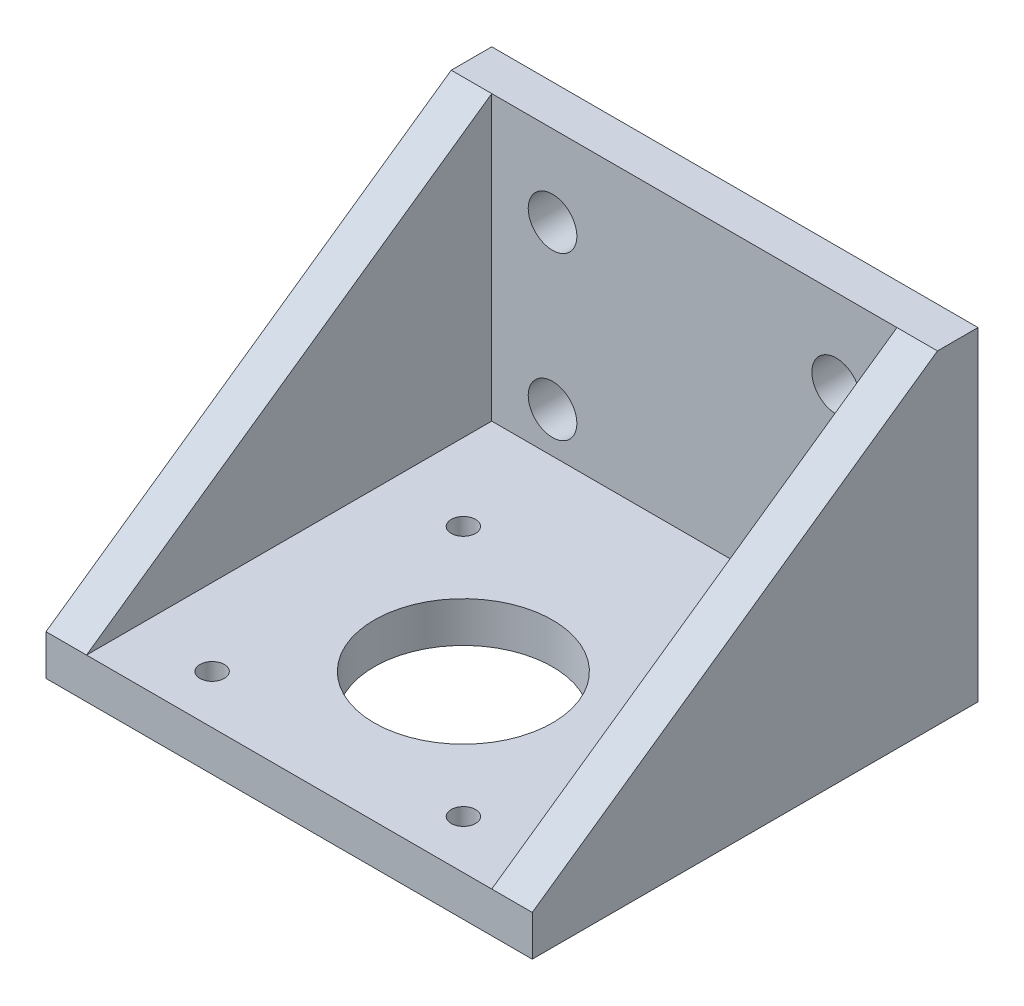
ISO-10303-21;
HEADER;
FILE_DESCRIPTION(('STEP AP214'),'2;1');
FILE_NAME('part.step','',(''),(''),'','','');
FILE_SCHEMA(('AUTOMOTIVE_DESIGN { 1 0 10303 214 1 1 1 1 }'));
ENDSEC;
DATA;
#1=APPLICATION_CONTEXT('core data for automotive mechanical design processes');
#2=APPLICATION_PROTOCOL_DEFINITION('international standard','automotive_design',2000,#1);
#3=PRODUCT_CONTEXT('',#1,'mechanical');
#4=PRODUCT('Part','Part','',(#3));
#5=PRODUCT_RELATED_PRODUCT_CATEGORY('part','',(#4));
#6=PRODUCT_DEFINITION_FORMATION('','',#4);
#7=PRODUCT_DEFINITION_CONTEXT('part definition',#1,'design');
#8=PRODUCT_DEFINITION('design','',#6,#7);
#9=PRODUCT_DEFINITION_SHAPE('','',#8);
#10=(LENGTH_UNIT() NAMED_UNIT(*) SI_UNIT(.MILLI.,.METRE.));
#11=(NAMED_UNIT(*) PLANE_ANGLE_UNIT() SI_UNIT($,.RADIAN.));
#12=(NAMED_UNIT(*) SI_UNIT($,.STERADIAN.) SOLID_ANGLE_UNIT());
#13=UNCERTAINTY_MEASURE_WITH_UNIT(LENGTH_MEASURE(1.E-05),#10,'distance_accuracy_value','');
#14=(GEOMETRIC_REPRESENTATION_CONTEXT(3) GLOBAL_UNCERTAINTY_ASSIGNED_CONTEXT((#13)) GLOBAL_UNIT_ASSIGNED_CONTEXT((#10,
#11,#12)) REPRESENTATION_CONTEXT('',''));
#15=CARTESIAN_POINT('',(0.,0.,0.));
#16=DIRECTION('',(0.,0.,1.));
#17=DIRECTION('',(1.,0.,0.));
#18=AXIS2_PLACEMENT_3D('',#15,#16,#17);
#19=CARTESIAN_POINT('',(0.,5.,0.));
#20=DIRECTION('',(0.,-1.,0.));
#21=DIRECTION('',(0.,0.,-1.));
#22=AXIS2_PLACEMENT_3D('',#19,#20,#21);
#23=PLANE('',#22);
#24=CARTESIAN_POINT('',(14.5,5.,-5.99999999999999));
#25=DIRECTION('',(0.,1.,0.));
#26=DIRECTION('',(0.,0.,1.));
#27=AXIS2_PLACEMENT_3D('',#24,#25,#26);
#28=CIRCLE('',#27,1.5);
#29=CARTESIAN_POINT('',(14.5,5.,-4.49999999999999));
#30=VERTEX_POINT('',#29);
#31=EDGE_CURVE('E141',#30,#30,#28,.T.);
#32=ORIENTED_EDGE('',*,*,#31,.F.);
#33=EDGE_LOOP('',(#32));
#34=FACE_BOUND('',#33,.T.);
#35=CARTESIAN_POINT('',(45.5,5.,-6.));
#36=DIRECTION('',(0.,1.,0.));
#37=DIRECTION('',(0.,0.,1.));
#38=AXIS2_PLACEMENT_3D('',#35,#36,#37);
#39=CIRCLE('',#38,1.5);
#40=CARTESIAN_POINT('',(45.5,5.,-4.49999999999999));
#41=VERTEX_POINT('',#40);
#42=EDGE_CURVE('E147',#41,#41,#39,.T.);
#43=ORIENTED_EDGE('',*,*,#42,.F.);
#44=EDGE_LOOP('',(#43));
#45=FACE_BOUND('',#44,.T.);
#46=CARTESIAN_POINT('',(45.5,5.,-37.));
#47=DIRECTION('',(0.,1.,0.));
#48=DIRECTION('',(0.,0.,1.));
#49=AXIS2_PLACEMENT_3D('',#46,#47,#48);
#50=CIRCLE('',#49,1.5);
#51=CARTESIAN_POINT('',(45.5,5.,-35.5));
#52=VERTEX_POINT('',#51);
#53=EDGE_CURVE('E153',#52,#52,#50,.T.);
#54=ORIENTED_EDGE('',*,*,#53,.F.);
#55=EDGE_LOOP('',(#54));
#56=FACE_BOUND('',#55,.T.);
#57=CARTESIAN_POINT('',(14.5,5.,-37.));
#58=DIRECTION('',(0.,1.,0.));
#59=DIRECTION('',(0.,0.,1.));
#60=AXIS2_PLACEMENT_3D('',#57,#58,#59);
#61=CIRCLE('',#60,1.5);
#62=CARTESIAN_POINT('',(14.5,5.,-35.5));
#63=VERTEX_POINT('',#62);
#64=EDGE_CURVE('E159',#63,#63,#61,.T.);
#65=ORIENTED_EDGE('',*,*,#64,.F.);
#66=EDGE_LOOP('',(#65));
#67=FACE_BOUND('',#66,.T.);
#68=CARTESIAN_POINT('',(30.,5.,-21.5));
#69=DIRECTION('',(0.,1.,0.));
#70=DIRECTION('',(0.,0.,1.));
#71=AXIS2_PLACEMENT_3D('',#68,#69,#70);
#72=CIRCLE('',#71,11.);
#73=CARTESIAN_POINT('',(30.,5.,-10.5));
#74=VERTEX_POINT('',#73);
#75=EDGE_CURVE('E165',#74,#74,#72,.T.);
#76=ORIENTED_EDGE('',*,*,#75,.F.);
#77=EDGE_LOOP('',(#76));
#78=FACE_BOUND('',#77,.T.);
#79=DIRECTION('',(0.,0.,-1.));
#80=VECTOR('',#79,1.);
#81=CARTESIAN_POINT('',(5.00000000000001,5.,0.));
#82=LINE('',#81,#80);
#83=CARTESIAN_POINT('',(5.,5.,0.));
#84=VERTEX_POINT('',#83);
#85=CARTESIAN_POINT('',(5.00000000000001,5.,-50.));
#86=VERTEX_POINT('',#85);
#87=EDGE_CURVE('E130',#84,#86,#82,.T.);
#88=ORIENTED_EDGE('',*,*,#87,.F.);
#89=DIRECTION('',(1.,0.,0.));
#90=VECTOR('',#89,1.);
#91=CARTESIAN_POINT('',(0.,5.,0.));
#92=LINE('',#91,#90);
#93=CARTESIAN_POINT('',(55.,5.,0.));
#94=VERTEX_POINT('',#93);
#95=EDGE_CURVE('E171',#84,#94,#92,.T.);
#96=ORIENTED_EDGE('',*,*,#95,.T.);
#97=DIRECTION('',(0.,0.,1.));
#98=VECTOR('',#97,1.);
#99=CARTESIAN_POINT('',(55.,5.,-50.));
#100=LINE('',#99,#98);
#101=CARTESIAN_POINT('',(55.,5.,-50.));
#102=VERTEX_POINT('',#101);
#103=EDGE_CURVE('E135',#102,#94,#100,.T.);
#104=ORIENTED_EDGE('',*,*,#103,.F.);
#105=DIRECTION('',(1.,0.,0.));
#106=VECTOR('',#105,1.);
#107=CARTESIAN_POINT('',(5.00000000000001,5.,-50.));
#108=LINE('',#107,#106);
#109=EDGE_CURVE('E58',#86,#102,#108,.T.);
#110=ORIENTED_EDGE('',*,*,#109,.F.);
#111=EDGE_LOOP('',(#88,#96,#104,#110));
#112=FACE_BOUND('',#111,.T.);
#113=ADVANCED_FACE('F35',(#34,#45,#56,#67,#78,#112),#23,.F.);
#114=CARTESIAN_POINT('',(0.,0.,0.));
#115=DIRECTION('',(0.,-1.,0.));
#116=DIRECTION('',(0.,0.,-1.));
#117=AXIS2_PLACEMENT_3D('',#114,#115,#116);
#118=PLANE('',#117);
#119=CARTESIAN_POINT('',(45.5,0.,-6.));
#120=DIRECTION('',(0.,1.,0.));
#121=DIRECTION('',(0.,0.,1.));
#122=AXIS2_PLACEMENT_3D('',#119,#120,#121);
#123=CIRCLE('',#122,1.5);
#124=CARTESIAN_POINT('',(45.5,0.,-4.49999999999999));
#125=VERTEX_POINT('',#124);
#126=EDGE_CURVE('E144',#125,#125,#123,.T.);
#127=ORIENTED_EDGE('',*,*,#126,.T.);
#128=EDGE_LOOP('',(#127));
#129=FACE_BOUND('',#128,.T.);
#130=CARTESIAN_POINT('',(14.5,0.,-37.));
#131=DIRECTION('',(0.,1.,0.));
#132=DIRECTION('',(0.,0.,1.));
#133=AXIS2_PLACEMENT_3D('',#130,#131,#132);
#134=CIRCLE('',#133,1.5);
#135=CARTESIAN_POINT('',(14.5,0.,-35.5));
#136=VERTEX_POINT('',#135);
#137=EDGE_CURVE('E156',#136,#136,#134,.T.);
#138=ORIENTED_EDGE('',*,*,#137,.T.);
#139=EDGE_LOOP('',(#138));
#140=FACE_BOUND('',#139,.T.);
#141=DIRECTION('',(0.,0.,1.));
#142=VECTOR('',#141,1.);
#143=CARTESIAN_POINT('',(0.,0.,0.));
#144=LINE('',#143,#142);
#145=CARTESIAN_POINT('',(0.,0.,-55.));
#146=VERTEX_POINT('',#145);
#147=CARTESIAN_POINT('',(0.,0.,0.));
#148=VERTEX_POINT('',#147);
#149=EDGE_CURVE('E168',#146,#148,#144,.T.);
#150=ORIENTED_EDGE('',*,*,#149,.F.);
#151=DIRECTION('',(-1.,0.,0.));
#152=VECTOR('',#151,1.);
#153=CARTESIAN_POINT('',(0.,0.,-55.));
#154=LINE('',#153,#152);
#155=CARTESIAN_POINT('',(60.,0.,-55.));
#156=VERTEX_POINT('',#155);
#157=EDGE_CURVE('E175',#156,#146,#154,.T.);
#158=ORIENTED_EDGE('',*,*,#157,.F.);
#159=DIRECTION('',(0.,0.,-1.));
#160=VECTOR('',#159,1.);
#161=CARTESIAN_POINT('',(60.,0.,0.));
#162=LINE('',#161,#160);
#163=CARTESIAN_POINT('',(60.,0.,0.));
#164=VERTEX_POINT('',#163);
#165=EDGE_CURVE('E180',#164,#156,#162,.T.);
#166=ORIENTED_EDGE('',*,*,#165,.F.);
#167=DIRECTION('',(1.,0.,0.));
#168=VECTOR('',#167,1.);
#169=CARTESIAN_POINT('',(0.,0.,0.));
#170=LINE('',#169,#168);
#171=EDGE_CURVE('E177',#148,#164,#170,.T.);
#172=ORIENTED_EDGE('',*,*,#171,.F.);
#173=EDGE_LOOP('',(#150,#158,#166,#172));
#174=FACE_BOUND('',#173,.T.);
#175=CARTESIAN_POINT('',(30.,0.,-21.5));
#176=DIRECTION('',(0.,1.,0.));
#177=DIRECTION('',(0.,0.,1.));
#178=AXIS2_PLACEMENT_3D('',#175,#176,#177);
#179=CIRCLE('',#178,11.);
#180=CARTESIAN_POINT('',(30.,0.,-10.5));
#181=VERTEX_POINT('',#180);
#182=EDGE_CURVE('E162',#181,#181,#179,.T.);
#183=ORIENTED_EDGE('',*,*,#182,.T.);
#184=EDGE_LOOP('',(#183));
#185=FACE_BOUND('',#184,.T.);
#186=CARTESIAN_POINT('',(45.5,0.,-37.));
#187=DIRECTION('',(0.,1.,0.));
#188=DIRECTION('',(0.,0.,1.));
#189=AXIS2_PLACEMENT_3D('',#186,#187,#188);
#190=CIRCLE('',#189,1.5);
#191=CARTESIAN_POINT('',(45.5,0.,-35.5));
#192=VERTEX_POINT('',#191);
#193=EDGE_CURVE('E150',#192,#192,#190,.T.);
#194=ORIENTED_EDGE('',*,*,#193,.T.);
#195=EDGE_LOOP('',(#194));
#196=FACE_BOUND('',#195,.T.);
#197=CARTESIAN_POINT('',(14.5,0.,-5.99999999999999));
#198=DIRECTION('',(0.,1.,0.));
#199=DIRECTION('',(0.,0.,1.));
#200=AXIS2_PLACEMENT_3D('',#197,#198,#199);
#201=CIRCLE('',#200,1.5);
#202=CARTESIAN_POINT('',(14.5,0.,-4.49999999999999));
#203=VERTEX_POINT('',#202);
#204=EDGE_CURVE('E140',#203,#203,#201,.T.);
#205=ORIENTED_EDGE('',*,*,#204,.T.);
#206=EDGE_LOOP('',(#205));
#207=FACE_BOUND('',#206,.T.);
#208=ADVANCED_FACE('F197',(#129,#140,#174,#185,#196,#207),#118,.T.);
#209=CARTESIAN_POINT('',(0.,5.,0.));
#210=DIRECTION('',(1.,0.,0.));
#211=DIRECTION('',(0.,0.,-1.));
#212=AXIS2_PLACEMENT_3D('',#209,#210,#211);
#213=PLANE('',#212);
#214=DIRECTION('',(0.,-1.,0.));
#215=VECTOR('',#214,1.);
#216=CARTESIAN_POINT('',(0.,5.,0.));
#217=LINE('',#216,#215);
#218=CARTESIAN_POINT('',(0.,5.,0.));
#219=VERTEX_POINT('',#218);
#220=EDGE_CURVE('E43',#219,#148,#217,.T.);
#221=ORIENTED_EDGE('',*,*,#220,.F.);
#222=DIRECTION('',(0.,-0.573462344363328,0.81923192051904));
#223=VECTOR('',#222,1.);
#224=CARTESIAN_POINT('',(0.,5.,0.));
#225=LINE('',#224,#223);
#226=CARTESIAN_POINT('',(0.,40.,-50.));
#227=VERTEX_POINT('',#226);
#228=EDGE_CURVE('E101',#227,#219,#225,.T.);
#229=ORIENTED_EDGE('',*,*,#228,.F.);
#230=DIRECTION('',(0.,0.,1.));
#231=VECTOR('',#230,1.);
#232=CARTESIAN_POINT('',(0.,40.,-55.));
#233=LINE('',#232,#231);
#234=CARTESIAN_POINT('',(0.,40.,-55.));
#235=VERTEX_POINT('',#234);
#236=EDGE_CURVE('E113',#235,#227,#233,.T.);
#237=ORIENTED_EDGE('',*,*,#236,.F.);
#238=DIRECTION('',(0.,-1.,0.));
#239=VECTOR('',#238,1.);
#240=CARTESIAN_POINT('',(0.,5.,-55.));
#241=LINE('',#240,#239);
#242=EDGE_CURVE('E174',#235,#146,#241,.T.);
#243=ORIENTED_EDGE('',*,*,#242,.T.);
#244=ORIENTED_EDGE('',*,*,#149,.T.);
#245=EDGE_LOOP('',(#221,#229,#237,#243,#244));
#246=FACE_BOUND('',#245,.T.);
#247=ADVANCED_FACE('F37',(#246),#213,.F.);
#248=CARTESIAN_POINT('',(0.,5.,0.));
#249=DIRECTION('',(0.,0.,-1.));
#250=DIRECTION('',(-1.,0.,0.));
#251=AXIS2_PLACEMENT_3D('',#248,#249,#250);
#252=PLANE('',#251);
#253=DIRECTION('',(0.,-1.,0.));
#254=VECTOR('',#253,1.);
#255=CARTESIAN_POINT('',(60.,5.,0.));
#256=LINE('',#255,#254);
#257=CARTESIAN_POINT('',(60.,5.,0.));
#258=VERTEX_POINT('',#257);
#259=EDGE_CURVE('E187',#258,#164,#256,.T.);
#260=ORIENTED_EDGE('',*,*,#259,.F.);
#261=DIRECTION('',(-1.,0.,0.));
#262=VECTOR('',#261,1.);
#263=CARTESIAN_POINT('',(121.032778078669,5.,0.));
#264=LINE('',#263,#262);
#265=EDGE_CURVE('E207',#258,#94,#264,.T.);
#266=ORIENTED_EDGE('',*,*,#265,.T.);
#267=ORIENTED_EDGE('',*,*,#95,.F.);
#268=EDGE_CURVE('E194',#84,#219,#264,.T.);
#269=ORIENTED_EDGE('',*,*,#268,.T.);
#270=ORIENTED_EDGE('',*,*,#220,.T.);
#271=ORIENTED_EDGE('',*,*,#171,.T.);
#272=EDGE_LOOP('',(#260,#266,#267,#269,#270,#271));
#273=FACE_BOUND('',#272,.T.);
#274=ADVANCED_FACE('F191',(#273),#252,.F.);
#275=CARTESIAN_POINT('',(60.,5.,0.));
#276=DIRECTION('',(-1.,0.,0.));
#277=DIRECTION('',(0.,0.,1.));
#278=AXIS2_PLACEMENT_3D('',#275,#276,#277);
#279=PLANE('',#278);
#280=DIRECTION('',(0.,0.,-1.));
#281=VECTOR('',#280,1.);
#282=CARTESIAN_POINT('',(60.,40.,0.));
#283=LINE('',#282,#281);
#284=CARTESIAN_POINT('',(60.,40.,-50.));
#285=VERTEX_POINT('',#284);
#286=CARTESIAN_POINT('',(60.,40.,-55.));
#287=VERTEX_POINT('',#286);
#288=EDGE_CURVE('E126',#285,#287,#283,.T.);
#289=ORIENTED_EDGE('',*,*,#288,.F.);
#290=DIRECTION('',(0.,0.573462344363328,-0.81923192051904));
#291=VECTOR('',#290,1.);
#292=CARTESIAN_POINT('',(60.,5.,0.));
#293=LINE('',#292,#291);
#294=EDGE_CURVE('E50',#258,#285,#293,.T.);
#295=ORIENTED_EDGE('',*,*,#294,.F.);
#296=ORIENTED_EDGE('',*,*,#259,.T.);
#297=ORIENTED_EDGE('',*,*,#165,.T.);
#298=DIRECTION('',(0.,-1.,0.));
#299=VECTOR('',#298,1.);
#300=CARTESIAN_POINT('',(60.,5.,-55.));
#301=LINE('',#300,#299);
#302=EDGE_CURVE('E184',#287,#156,#301,.T.);
#303=ORIENTED_EDGE('',*,*,#302,.F.);
#304=EDGE_LOOP('',(#289,#295,#296,#297,#303));
#305=FACE_BOUND('',#304,.T.);
#306=ADVANCED_FACE('F205',(#305),#279,.F.);
#307=CARTESIAN_POINT('',(0.,5.,-55.));
#308=DIRECTION('',(0.,0.,1.));
#309=DIRECTION('',(1.,0.,0.));
#310=AXIS2_PLACEMENT_3D('',#307,#308,#309);
#311=PLANE('',#310);
#312=CARTESIAN_POINT('',(12.5,30.,-55.));
#313=DIRECTION('',(0.,0.,-1.));
#314=DIRECTION('',(-1.,0.,0.));
#315=AXIS2_PLACEMENT_3D('',#312,#313,#314);
#316=CIRCLE('',#315,3.);
#317=CARTESIAN_POINT('',(9.49999999999999,30.,-55.));
#318=VERTEX_POINT('',#317);
#319=EDGE_CURVE('E227',#318,#318,#316,.T.);
#320=ORIENTED_EDGE('',*,*,#319,.F.);
#321=EDGE_LOOP('',(#320));
#322=FACE_BOUND('',#321,.T.);
#323=CARTESIAN_POINT('',(47.5,30.,-55.));
#324=DIRECTION('',(0.,0.,-1.));
#325=DIRECTION('',(-1.,0.,0.));
#326=AXIS2_PLACEMENT_3D('',#323,#324,#325);
#327=CIRCLE('',#326,3.);
#328=CARTESIAN_POINT('',(44.5,30.,-55.));
#329=VERTEX_POINT('',#328);
#330=EDGE_CURVE('E235',#329,#329,#327,.T.);
#331=ORIENTED_EDGE('',*,*,#330,.F.);
#332=EDGE_LOOP('',(#331));
#333=FACE_BOUND('',#332,.T.);
#334=CARTESIAN_POINT('',(47.5,10.,-55.));
#335=DIRECTION('',(0.,0.,-1.));
#336=DIRECTION('',(-1.,0.,0.));
#337=AXIS2_PLACEMENT_3D('',#334,#335,#336);
#338=CIRCLE('',#337,3.);
#339=CARTESIAN_POINT('',(44.5,10.,-55.));
#340=VERTEX_POINT('',#339);
#341=EDGE_CURVE('E219',#340,#340,#338,.T.);
#342=ORIENTED_EDGE('',*,*,#341,.F.);
#343=EDGE_LOOP('',(#342));
#344=FACE_BOUND('',#343,.T.);
#345=CARTESIAN_POINT('',(12.5,10.,-55.));
#346=DIRECTION('',(0.,0.,-1.));
#347=DIRECTION('',(-1.,0.,0.));
#348=AXIS2_PLACEMENT_3D('',#345,#346,#347);
#349=CIRCLE('',#348,3.);
#350=CARTESIAN_POINT('',(9.49999999999999,10.,-55.));
#351=VERTEX_POINT('',#350);
#352=EDGE_CURVE('E234',#351,#351,#349,.T.);
#353=ORIENTED_EDGE('',*,*,#352,.F.);
#354=EDGE_LOOP('',(#353));
#355=FACE_BOUND('',#354,.T.);
#356=ORIENTED_EDGE('',*,*,#157,.T.);
#357=ORIENTED_EDGE('',*,*,#242,.F.);
#358=DIRECTION('',(-1.,0.,0.));
#359=VECTOR('',#358,1.);
#360=CARTESIAN_POINT('',(60.,40.,-55.));
#361=LINE('',#360,#359);
#362=EDGE_CURVE('E120',#287,#235,#361,.T.);
#363=ORIENTED_EDGE('',*,*,#362,.F.);
#364=ORIENTED_EDGE('',*,*,#302,.T.);
#365=EDGE_LOOP('',(#356,#357,#363,#364));
#366=FACE_BOUND('',#365,.T.);
#367=ADVANCED_FACE('F201',(#322,#333,#344,#355,#366),#311,.F.);
#368=CARTESIAN_POINT('',(30.,5.,-21.5));
#369=DIRECTION('',(0.,-1.,0.));
#370=DIRECTION('',(0.,0.,-1.));
#371=AXIS2_PLACEMENT_3D('',#368,#369,#370);
#372=CYLINDRICAL_SURFACE('',#371,11.);
#373=ORIENTED_EDGE('',*,*,#75,.T.);
#374=EDGE_LOOP('',(#373));
#375=FACE_BOUND('',#374,.T.);
#376=ORIENTED_EDGE('',*,*,#182,.F.);
#377=EDGE_LOOP('',(#376));
#378=FACE_BOUND('',#377,.T.);
#379=ADVANCED_FACE('F269',(#375,#378),#372,.F.);
#380=CARTESIAN_POINT('',(14.5,5.,-37.));
#381=DIRECTION('',(0.,-1.,0.));
#382=DIRECTION('',(0.,0.,-1.));
#383=AXIS2_PLACEMENT_3D('',#380,#381,#382);
#384=CYLINDRICAL_SURFACE('',#383,1.5);
#385=ORIENTED_EDGE('',*,*,#64,.T.);
#386=EDGE_LOOP('',(#385));
#387=FACE_BOUND('',#386,.T.);
#388=ORIENTED_EDGE('',*,*,#137,.F.);
#389=EDGE_LOOP('',(#388));
#390=FACE_BOUND('',#389,.T.);
#391=ADVANCED_FACE('F296',(#387,#390),#384,.F.);
#392=CARTESIAN_POINT('',(45.5,5.,-37.));
#393=DIRECTION('',(0.,-1.,0.));
#394=DIRECTION('',(0.,0.,-1.));
#395=AXIS2_PLACEMENT_3D('',#392,#393,#394);
#396=CYLINDRICAL_SURFACE('',#395,1.5);
#397=ORIENTED_EDGE('',*,*,#53,.T.);
#398=EDGE_LOOP('',(#397));
#399=FACE_BOUND('',#398,.T.);
#400=ORIENTED_EDGE('',*,*,#193,.F.);
#401=EDGE_LOOP('',(#400));
#402=FACE_BOUND('',#401,.T.);
#403=ADVANCED_FACE('F306',(#399,#402),#396,.F.);
#404=CARTESIAN_POINT('',(45.5,5.,-6.));
#405=DIRECTION('',(0.,-1.,0.));
#406=DIRECTION('',(0.,0.,-1.));
#407=AXIS2_PLACEMENT_3D('',#404,#405,#406);
#408=CYLINDRICAL_SURFACE('',#407,1.5);
#409=ORIENTED_EDGE('',*,*,#42,.T.);
#410=EDGE_LOOP('',(#409));
#411=FACE_BOUND('',#410,.T.);
#412=ORIENTED_EDGE('',*,*,#126,.F.);
#413=EDGE_LOOP('',(#412));
#414=FACE_BOUND('',#413,.T.);
#415=ADVANCED_FACE('F315',(#411,#414),#408,.F.);
#416=CARTESIAN_POINT('',(14.5,5.,-5.99999999999999));
#417=DIRECTION('',(0.,-1.,0.));
#418=DIRECTION('',(0.,0.,-1.));
#419=AXIS2_PLACEMENT_3D('',#416,#417,#418);
#420=CYLINDRICAL_SURFACE('',#419,1.5);
#421=ORIENTED_EDGE('',*,*,#31,.T.);
#422=EDGE_LOOP('',(#421));
#423=FACE_BOUND('',#422,.T.);
#424=ORIENTED_EDGE('',*,*,#204,.F.);
#425=EDGE_LOOP('',(#424));
#426=FACE_BOUND('',#425,.T.);
#427=ADVANCED_FACE('F325',(#423,#426),#420,.F.);
#428=CARTESIAN_POINT('',(5.00000000000001,40.,0.));
#429=DIRECTION('',(-1.,0.,0.));
#430=DIRECTION('',(0.,0.,1.));
#431=AXIS2_PLACEMENT_3D('',#428,#429,#430);
#432=PLANE('',#431);
#433=DIRECTION('',(0.,-1.,0.));
#434=VECTOR('',#433,1.);
#435=CARTESIAN_POINT('',(5.00000000000001,40.,-50.));
#436=LINE('',#435,#434);
#437=CARTESIAN_POINT('',(5.00000000000001,40.,-50.));
#438=VERTEX_POINT('',#437);
#439=EDGE_CURVE('E124',#438,#86,#436,.T.);
#440=ORIENTED_EDGE('',*,*,#439,.F.);
#441=DIRECTION('',(0.,-0.573462344363328,0.81923192051904));
#442=VECTOR('',#441,1.);
#443=CARTESIAN_POINT('',(5.00000000000001,16.510067114094,-16.4429530201342));
#444=LINE('',#443,#442);
#445=EDGE_CURVE('E104',#438,#84,#444,.T.);
#446=ORIENTED_EDGE('',*,*,#445,.T.);
#447=ORIENTED_EDGE('',*,*,#87,.T.);
#448=EDGE_LOOP('',(#440,#446,#447));
#449=FACE_BOUND('',#448,.T.);
#450=ADVANCED_FACE('F218',(#449),#432,.F.);
#451=CARTESIAN_POINT('',(5.00000000000001,40.,-50.));
#452=DIRECTION('',(0.,0.,-1.));
#453=DIRECTION('',(-1.,0.,0.));
#454=AXIS2_PLACEMENT_3D('',#451,#452,#453);
#455=PLANE('',#454);
#456=CARTESIAN_POINT('',(12.5,30.,-50.));
#457=DIRECTION('',(0.,0.,-1.));
#458=DIRECTION('',(-1.,0.,0.));
#459=AXIS2_PLACEMENT_3D('',#456,#457,#458);
#460=CIRCLE('',#459,3.);
#461=CARTESIAN_POINT('',(9.49999999999999,30.,-50.));
#462=VERTEX_POINT('',#461);
#463=EDGE_CURVE('E230',#462,#462,#460,.F.);
#464=ORIENTED_EDGE('',*,*,#463,.F.);
#465=EDGE_LOOP('',(#464));
#466=FACE_BOUND('',#465,.T.);
#467=CARTESIAN_POINT('',(47.5,30.,-50.));
#468=DIRECTION('',(0.,0.,-1.));
#469=DIRECTION('',(-1.,0.,0.));
#470=AXIS2_PLACEMENT_3D('',#467,#468,#469);
#471=CIRCLE('',#470,3.);
#472=CARTESIAN_POINT('',(44.5,30.,-50.));
#473=VERTEX_POINT('',#472);
#474=EDGE_CURVE('E231',#473,#473,#471,.F.);
#475=ORIENTED_EDGE('',*,*,#474,.F.);
#476=EDGE_LOOP('',(#475));
#477=FACE_BOUND('',#476,.T.);
#478=CARTESIAN_POINT('',(47.5,10.,-50.));
#479=DIRECTION('',(0.,0.,-1.));
#480=DIRECTION('',(-1.,0.,0.));
#481=AXIS2_PLACEMENT_3D('',#478,#479,#480);
#482=CIRCLE('',#481,3.);
#483=CARTESIAN_POINT('',(44.5,10.,-50.));
#484=VERTEX_POINT('',#483);
#485=EDGE_CURVE('E222',#484,#484,#482,.F.);
#486=ORIENTED_EDGE('',*,*,#485,.F.);
#487=EDGE_LOOP('',(#486));
#488=FACE_BOUND('',#487,.T.);
#489=CARTESIAN_POINT('',(12.5,10.,-50.));
#490=DIRECTION('',(0.,0.,-1.));
#491=DIRECTION('',(-1.,0.,0.));
#492=AXIS2_PLACEMENT_3D('',#489,#490,#491);
#493=CIRCLE('',#492,3.);
#494=CARTESIAN_POINT('',(9.49999999999999,10.,-50.));
#495=VERTEX_POINT('',#494);
#496=EDGE_CURVE('E133',#495,#495,#493,.F.);
#497=ORIENTED_EDGE('',*,*,#496,.F.);
#498=EDGE_LOOP('',(#497));
#499=FACE_BOUND('',#498,.T.);
#500=ORIENTED_EDGE('',*,*,#109,.T.);
#501=DIRECTION('',(0.,-1.,0.));
#502=VECTOR('',#501,1.);
#503=CARTESIAN_POINT('',(55.,40.,-50.));
#504=LINE('',#503,#502);
#505=CARTESIAN_POINT('',(55.,40.,-50.));
#506=VERTEX_POINT('',#505);
#507=EDGE_CURVE('E121',#506,#102,#504,.T.);
#508=ORIENTED_EDGE('',*,*,#507,.F.);
#509=DIRECTION('',(1.,0.,0.));
#510=VECTOR('',#509,1.);
#511=CARTESIAN_POINT('',(5.00000000000001,40.,-50.));
#512=LINE('',#511,#510);
#513=EDGE_CURVE('E137',#438,#506,#512,.T.);
#514=ORIENTED_EDGE('',*,*,#513,.F.);
#515=ORIENTED_EDGE('',*,*,#439,.T.);
#516=EDGE_LOOP('',(#500,#508,#514,#515));
#517=FACE_BOUND('',#516,.T.);
#518=ADVANCED_FACE('F215',(#466,#477,#488,#499,#517),#455,.F.);
#519=CARTESIAN_POINT('',(55.,40.,-50.));
#520=DIRECTION('',(1.,0.,0.));
#521=DIRECTION('',(0.,0.,-1.));
#522=AXIS2_PLACEMENT_3D('',#519,#520,#521);
#523=PLANE('',#522);
#524=ORIENTED_EDGE('',*,*,#103,.T.);
#525=DIRECTION('',(0.,0.573462344363328,-0.81923192051904));
#526=VECTOR('',#525,1.);
#527=CARTESIAN_POINT('',(55.,40.,-50.));
#528=LINE('',#527,#526);
#529=EDGE_CURVE('E212',#94,#506,#528,.T.);
#530=ORIENTED_EDGE('',*,*,#529,.T.);
#531=ORIENTED_EDGE('',*,*,#507,.T.);
#532=EDGE_LOOP('',(#524,#530,#531));
#533=FACE_BOUND('',#532,.T.);
#534=ADVANCED_FACE('F211',(#533),#523,.F.);
#535=CARTESIAN_POINT('',(0.,40.,0.));
#536=DIRECTION('',(0.,-1.,0.));
#537=DIRECTION('',(0.,0.,-1.));
#538=AXIS2_PLACEMENT_3D('',#535,#536,#537);
#539=PLANE('',#538);
#540=ORIENTED_EDGE('',*,*,#236,.T.);
#541=DIRECTION('',(1.,0.,0.));
#542=VECTOR('',#541,1.);
#543=CARTESIAN_POINT('',(0.,40.,-50.));
#544=LINE('',#543,#542);
#545=EDGE_CURVE('E11',#227,#438,#544,.T.);
#546=ORIENTED_EDGE('',*,*,#545,.T.);
#547=ORIENTED_EDGE('',*,*,#513,.T.);
#548=DIRECTION('',(-1.,0.,0.));
#549=VECTOR('',#548,1.);
#550=CARTESIAN_POINT('',(121.032778078669,40.,-50.));
#551=LINE('',#550,#549);
#552=EDGE_CURVE('E115',#285,#506,#551,.T.);
#553=ORIENTED_EDGE('',*,*,#552,.F.);
#554=ORIENTED_EDGE('',*,*,#288,.T.);
#555=ORIENTED_EDGE('',*,*,#362,.T.);
#556=EDGE_LOOP('',(#540,#546,#547,#553,#554,#555));
#557=FACE_BOUND('',#556,.T.);
#558=ADVANCED_FACE('F118',(#557),#539,.F.);
#559=CARTESIAN_POINT('',(12.5,10.,-41.5147186257614));
#560=DIRECTION('',(0.,0.,-1.));
#561=DIRECTION('',(-1.,0.,0.));
#562=AXIS2_PLACEMENT_3D('',#559,#560,#561);
#563=CYLINDRICAL_SURFACE('',#562,3.);
#564=CARTESIAN_POINT('',(9.49999999999999,10.,-50.));
#565=CARTESIAN_POINT('',(9.49999999999999,10.,-50.0520833333333));
#566=CARTESIAN_POINT('',(9.49999999999999,10.,-50.1041666666667));
#567=CARTESIAN_POINT('',(9.49999999999999,10.,-50.2083333333333));
#568=CARTESIAN_POINT('',(9.49999999999999,10.,-50.2604166666667));
#569=CARTESIAN_POINT('',(9.49999999999999,10.,-50.3645833333333));
#570=CARTESIAN_POINT('',(9.49999999999999,10.,-50.4166666666667));
#571=CARTESIAN_POINT('',(9.49999999999999,10.,-50.5208333333333));
#572=CARTESIAN_POINT('',(9.49999999999999,10.,-50.5729166666667));
#573=CARTESIAN_POINT('',(9.49999999999999,10.,-50.6770833333333));
#574=CARTESIAN_POINT('',(9.49999999999999,10.,-50.7291666666667));
#575=CARTESIAN_POINT('',(9.49999999999999,10.,-50.8333333333333));
#576=CARTESIAN_POINT('',(9.49999999999999,10.,-50.8854166666667));
#577=CARTESIAN_POINT('',(9.49999999999999,10.,-50.9895833333333));
#578=CARTESIAN_POINT('',(9.49999999999999,10.,-51.0416666666667));
#579=CARTESIAN_POINT('',(9.49999999999999,10.,-51.1458333333333));
#580=CARTESIAN_POINT('',(9.49999999999999,10.,-51.1979166666667));
#581=CARTESIAN_POINT('',(9.49999999999999,10.,-51.3020833333333));
#582=CARTESIAN_POINT('',(9.49999999999999,10.,-51.3541666666667));
#583=CARTESIAN_POINT('',(9.49999999999999,10.,-51.4583333333333));
#584=CARTESIAN_POINT('',(9.49999999999999,10.,-51.5104166666667));
#585=CARTESIAN_POINT('',(9.49999999999999,10.,-51.6145833333333));
#586=CARTESIAN_POINT('',(9.49999999999999,10.,-51.6666666666667));
#587=CARTESIAN_POINT('',(9.49999999999999,10.,-51.7708333333333));
#588=CARTESIAN_POINT('',(9.49999999999999,10.,-51.8229166666667));
#589=CARTESIAN_POINT('',(9.49999999999999,10.,-51.9270833333333));
#590=CARTESIAN_POINT('',(9.49999999999999,10.,-51.9791666666667));
#591=CARTESIAN_POINT('',(9.49999999999999,10.,-52.0833333333333));
#592=CARTESIAN_POINT('',(9.49999999999999,10.,-52.1354166666667));
#593=CARTESIAN_POINT('',(9.49999999999999,10.,-52.2395833333333));
#594=CARTESIAN_POINT('',(9.49999999999999,10.,-52.2916666666667));
#595=CARTESIAN_POINT('',(9.49999999999999,10.,-52.3958333333333));
#596=CARTESIAN_POINT('',(9.49999999999999,10.,-52.4479166666667));
#597=CARTESIAN_POINT('',(9.49999999999999,10.,-52.5520833333333));
#598=CARTESIAN_POINT('',(9.49999999999999,10.,-52.6041666666667));
#599=CARTESIAN_POINT('',(9.49999999999999,10.,-52.7083333333333));
#600=CARTESIAN_POINT('',(9.49999999999999,10.,-52.7604166666667));
#601=CARTESIAN_POINT('',(9.49999999999999,10.,-52.8645833333333));
#602=CARTESIAN_POINT('',(9.49999999999999,10.,-52.9166666666667));
#603=CARTESIAN_POINT('',(9.49999999999999,10.,-53.0208333333333));
#604=CARTESIAN_POINT('',(9.49999999999999,10.,-53.0729166666667));
#605=CARTESIAN_POINT('',(9.49999999999999,10.,-53.1770833333333));
#606=CARTESIAN_POINT('',(9.49999999999999,10.,-53.2291666666667));
#607=CARTESIAN_POINT('',(9.49999999999999,10.,-53.3333333333333));
#608=CARTESIAN_POINT('',(9.49999999999999,10.,-53.3854166666667));
#609=CARTESIAN_POINT('',(9.49999999999999,10.,-53.4895833333333));
#610=CARTESIAN_POINT('',(9.49999999999999,10.,-53.5416666666667));
#611=CARTESIAN_POINT('',(9.49999999999999,10.,-53.6458333333333));
#612=CARTESIAN_POINT('',(9.49999999999999,10.,-53.6979166666667));
#613=CARTESIAN_POINT('',(9.49999999999999,10.,-53.8020833333333));
#614=CARTESIAN_POINT('',(9.49999999999999,10.,-53.8541666666667));
#615=CARTESIAN_POINT('',(9.49999999999999,10.,-53.9583333333333));
#616=CARTESIAN_POINT('',(9.49999999999999,10.,-54.0104166666667));
#617=CARTESIAN_POINT('',(9.49999999999999,10.,-54.1145833333333));
#618=CARTESIAN_POINT('',(9.49999999999999,10.,-54.1666666666667));
#619=CARTESIAN_POINT('',(9.49999999999999,10.,-54.2708333333333));
#620=CARTESIAN_POINT('',(9.49999999999999,10.,-54.3229166666667));
#621=CARTESIAN_POINT('',(9.49999999999999,10.,-54.4270833333333));
#622=CARTESIAN_POINT('',(9.49999999999999,10.,-54.4791666666667));
#623=CARTESIAN_POINT('',(9.49999999999999,10.,-54.5833333333333));
#624=CARTESIAN_POINT('',(9.49999999999999,10.,-54.6354166666667));
#625=CARTESIAN_POINT('',(9.49999999999999,10.,-54.7395833333333));
#626=CARTESIAN_POINT('',(9.49999999999999,10.,-54.7916666666667));
#627=CARTESIAN_POINT('',(9.49999999999999,10.,-54.8958333333333));
#628=CARTESIAN_POINT('',(9.49999999999999,10.,-54.9479166666667));
#629=CARTESIAN_POINT('',(9.49999999999999,10.,-55.));
#630=B_SPLINE_CURVE_WITH_KNOTS('',3,(#564,#565,#566,#567,#568,#569,#570,#571,#572,#573,#574,
#575,#576,#577,#578,#579,#580,#581,#582,#583,#584,#585,#586,#587,#588,#589,#590,#591,#592,#593,
#594,#595,#596,#597,#598,#599,#600,#601,#602,#603,#604,#605,#606,#607,#608,#609,#610,#611,#612,
#613,#614,#615,#616,#617,#618,#619,#620,#621,#622,#623,#624,#625,#626,#627,#628,#629),
.UNSPECIFIED.,.F.,.F.,(4,2,2,2,2,2,2,2,2,2,2,2,2,2,2,2,2,2,2,2,2,2,2,2,2,2,2,2,2,2,2,2,4),(0.,
0.156249999999997,0.3125,0.468749999999997,0.625000000000001,0.781249999999997,
0.937500000000001,1.09375,1.25,1.40625,1.5625,1.71875,1.875,2.03125,2.1875,2.34375,2.5,2.65625,
2.8125,2.96875,3.125,3.28125,3.4375,3.59375,3.75,3.90625,4.0625,4.21875,4.375,4.53125,4.6875,
4.84375,5.),.UNSPECIFIED.);
#631=EDGE_CURVE('BSEAM350',#495,#351,#630,.T.);
#632=ORIENTED_EDGE('',*,*,#496,.T.);
#633=ORIENTED_EDGE('',*,*,#352,.T.);
#634=ORIENTED_EDGE('',*,*,#631,.T.);
#635=ORIENTED_EDGE('',*,*,#631,.F.);
#636=EDGE_LOOP('',(#632,#634,#633,#635));
#637=FACE_BOUND('',#636,.T.);
#638=ADVANCED_FACE('F350',(#637),#563,.F.);
#639=CARTESIAN_POINT('',(47.5,10.,-41.5147186257614));
#640=DIRECTION('',(0.,0.,-1.));
#641=DIRECTION('',(-1.,0.,0.));
#642=AXIS2_PLACEMENT_3D('',#639,#640,#641);
#643=CYLINDRICAL_SURFACE('',#642,3.);
#644=CARTESIAN_POINT('',(44.5,10.,-50.));
#645=CARTESIAN_POINT('',(44.5,10.,-50.0520833333333));
#646=CARTESIAN_POINT('',(44.5,10.,-50.1041666666667));
#647=CARTESIAN_POINT('',(44.5,10.,-50.2083333333333));
#648=CARTESIAN_POINT('',(44.5,10.,-50.2604166666667));
#649=CARTESIAN_POINT('',(44.5,10.,-50.3645833333333));
#650=CARTESIAN_POINT('',(44.5,10.,-50.4166666666667));
#651=CARTESIAN_POINT('',(44.5,10.,-50.5208333333333));
#652=CARTESIAN_POINT('',(44.5,10.,-50.5729166666667));
#653=CARTESIAN_POINT('',(44.5,10.,-50.6770833333333));
#654=CARTESIAN_POINT('',(44.5,10.,-50.7291666666667));
#655=CARTESIAN_POINT('',(44.5,10.,-50.8333333333333));
#656=CARTESIAN_POINT('',(44.5,10.,-50.8854166666667));
#657=CARTESIAN_POINT('',(44.5,10.,-50.9895833333333));
#658=CARTESIAN_POINT('',(44.5,10.,-51.0416666666667));
#659=CARTESIAN_POINT('',(44.5,10.,-51.1458333333333));
#660=CARTESIAN_POINT('',(44.5,10.,-51.1979166666667));
#661=CARTESIAN_POINT('',(44.5,10.,-51.3020833333333));
#662=CARTESIAN_POINT('',(44.5,10.,-51.3541666666667));
#663=CARTESIAN_POINT('',(44.5,10.,-51.4583333333333));
#664=CARTESIAN_POINT('',(44.5,10.,-51.5104166666667));
#665=CARTESIAN_POINT('',(44.5,10.,-51.6145833333333));
#666=CARTESIAN_POINT('',(44.5,10.,-51.6666666666667));
#667=CARTESIAN_POINT('',(44.5,10.,-51.7708333333333));
#668=CARTESIAN_POINT('',(44.5,10.,-51.8229166666667));
#669=CARTESIAN_POINT('',(44.5,10.,-51.9270833333333));
#670=CARTESIAN_POINT('',(44.5,10.,-51.9791666666667));
#671=CARTESIAN_POINT('',(44.5,10.,-52.0833333333333));
#672=CARTESIAN_POINT('',(44.5,10.,-52.1354166666667));
#673=CARTESIAN_POINT('',(44.5,10.,-52.2395833333333));
#674=CARTESIAN_POINT('',(44.5,10.,-52.2916666666667));
#675=CARTESIAN_POINT('',(44.5,10.,-52.3958333333333));
#676=CARTESIAN_POINT('',(44.5,10.,-52.4479166666667));
#677=CARTESIAN_POINT('',(44.5,10.,-52.5520833333333));
#678=CARTESIAN_POINT('',(44.5,10.,-52.6041666666667));
#679=CARTESIAN_POINT('',(44.5,10.,-52.7083333333333));
#680=CARTESIAN_POINT('',(44.5,10.,-52.7604166666667));
#681=CARTESIAN_POINT('',(44.5,10.,-52.8645833333333));
#682=CARTESIAN_POINT('',(44.5,10.,-52.9166666666667));
#683=CARTESIAN_POINT('',(44.5,10.,-53.0208333333333));
#684=CARTESIAN_POINT('',(44.5,10.,-53.0729166666667));
#685=CARTESIAN_POINT('',(44.5,10.,-53.1770833333333));
#686=CARTESIAN_POINT('',(44.5,10.,-53.2291666666667));
#687=CARTESIAN_POINT('',(44.5,10.,-53.3333333333333));
#688=CARTESIAN_POINT('',(44.5,10.,-53.3854166666667));
#689=CARTESIAN_POINT('',(44.5,10.,-53.4895833333333));
#690=CARTESIAN_POINT('',(44.5,10.,-53.5416666666667));
#691=CARTESIAN_POINT('',(44.5,10.,-53.6458333333333));
#692=CARTESIAN_POINT('',(44.5,10.,-53.6979166666667));
#693=CARTESIAN_POINT('',(44.5,10.,-53.8020833333333));
#694=CARTESIAN_POINT('',(44.5,10.,-53.8541666666667));
#695=CARTESIAN_POINT('',(44.5,10.,-53.9583333333333));
#696=CARTESIAN_POINT('',(44.5,10.,-54.0104166666667));
#697=CARTESIAN_POINT('',(44.5,10.,-54.1145833333333));
#698=CARTESIAN_POINT('',(44.5,10.,-54.1666666666667));
#699=CARTESIAN_POINT('',(44.5,10.,-54.2708333333333));
#700=CARTESIAN_POINT('',(44.5,10.,-54.3229166666667));
#701=CARTESIAN_POINT('',(44.5,10.,-54.4270833333333));
#702=CARTESIAN_POINT('',(44.5,10.,-54.4791666666667));
#703=CARTESIAN_POINT('',(44.5,10.,-54.5833333333333));
#704=CARTESIAN_POINT('',(44.5,10.,-54.6354166666667));
#705=CARTESIAN_POINT('',(44.5,10.,-54.7395833333333));
#706=CARTESIAN_POINT('',(44.5,10.,-54.7916666666667));
#707=CARTESIAN_POINT('',(44.5,10.,-54.8958333333333));
#708=CARTESIAN_POINT('',(44.5,10.,-54.9479166666667));
#709=CARTESIAN_POINT('',(44.5,10.,-55.));
#710=B_SPLINE_CURVE_WITH_KNOTS('',3,(#644,#645,#646,#647,#648,#649,#650,#651,#652,#653,#654,
#655,#656,#657,#658,#659,#660,#661,#662,#663,#664,#665,#666,#667,#668,#669,#670,#671,#672,#673,
#674,#675,#676,#677,#678,#679,#680,#681,#682,#683,#684,#685,#686,#687,#688,#689,#690,#691,#692,
#693,#694,#695,#696,#697,#698,#699,#700,#701,#702,#703,#704,#705,#706,#707,#708,#709),
.UNSPECIFIED.,.F.,.F.,(4,2,2,2,2,2,2,2,2,2,2,2,2,2,2,2,2,2,2,2,2,2,2,2,2,2,2,2,2,2,2,2,4),(0.,
0.156249999999997,0.3125,0.468749999999997,0.625000000000001,0.781249999999997,
0.937500000000001,1.09375,1.25,1.40625,1.5625,1.71875,1.875,2.03125,2.1875,2.34375,2.5,2.65625,
2.8125,2.96875,3.125,3.28125,3.4375,3.59375,3.75,3.90625,4.0625,4.21875,4.375,4.53125,4.6875,
4.84375,5.),.UNSPECIFIED.);
#711=EDGE_CURVE('BSEAM355',#484,#340,#710,.T.);
#712=ORIENTED_EDGE('',*,*,#485,.T.);
#713=ORIENTED_EDGE('',*,*,#341,.T.);
#714=ORIENTED_EDGE('',*,*,#711,.T.);
#715=ORIENTED_EDGE('',*,*,#711,.F.);
#716=EDGE_LOOP('',(#712,#714,#713,#715));
#717=FACE_BOUND('',#716,.T.);
#718=ADVANCED_FACE('F355',(#717),#643,.F.);
#719=CARTESIAN_POINT('',(47.5,30.,-41.5147186257614));
#720=DIRECTION('',(0.,0.,-1.));
#721=DIRECTION('',(-1.,0.,0.));
#722=AXIS2_PLACEMENT_3D('',#719,#720,#721);
#723=CYLINDRICAL_SURFACE('',#722,3.);
#724=CARTESIAN_POINT('',(44.5,30.,-50.));
#725=CARTESIAN_POINT('',(44.5,30.,-50.0520833333333));
#726=CARTESIAN_POINT('',(44.5,30.,-50.1041666666667));
#727=CARTESIAN_POINT('',(44.5,30.,-50.2083333333333));
#728=CARTESIAN_POINT('',(44.5,30.,-50.2604166666667));
#729=CARTESIAN_POINT('',(44.5,30.,-50.3645833333333));
#730=CARTESIAN_POINT('',(44.5,30.,-50.4166666666667));
#731=CARTESIAN_POINT('',(44.5,30.,-50.5208333333333));
#732=CARTESIAN_POINT('',(44.5,30.,-50.5729166666667));
#733=CARTESIAN_POINT('',(44.5,30.,-50.6770833333333));
#734=CARTESIAN_POINT('',(44.5,30.,-50.7291666666667));
#735=CARTESIAN_POINT('',(44.5,30.,-50.8333333333333));
#736=CARTESIAN_POINT('',(44.5,30.,-50.8854166666667));
#737=CARTESIAN_POINT('',(44.5,30.,-50.9895833333333));
#738=CARTESIAN_POINT('',(44.5,30.,-51.0416666666667));
#739=CARTESIAN_POINT('',(44.5,30.,-51.1458333333333));
#740=CARTESIAN_POINT('',(44.5,30.,-51.1979166666667));
#741=CARTESIAN_POINT('',(44.5,30.,-51.3020833333333));
#742=CARTESIAN_POINT('',(44.5,30.,-51.3541666666667));
#743=CARTESIAN_POINT('',(44.5,30.,-51.4583333333333));
#744=CARTESIAN_POINT('',(44.5,30.,-51.5104166666667));
#745=CARTESIAN_POINT('',(44.5,30.,-51.6145833333333));
#746=CARTESIAN_POINT('',(44.5,30.,-51.6666666666667));
#747=CARTESIAN_POINT('',(44.5,30.,-51.7708333333333));
#748=CARTESIAN_POINT('',(44.5,30.,-51.8229166666667));
#749=CARTESIAN_POINT('',(44.5,30.,-51.9270833333333));
#750=CARTESIAN_POINT('',(44.5,30.,-51.9791666666667));
#751=CARTESIAN_POINT('',(44.5,30.,-52.0833333333333));
#752=CARTESIAN_POINT('',(44.5,30.,-52.1354166666667));
#753=CARTESIAN_POINT('',(44.5,30.,-52.2395833333333));
#754=CARTESIAN_POINT('',(44.5,30.,-52.2916666666667));
#755=CARTESIAN_POINT('',(44.5,30.,-52.3958333333333));
#756=CARTESIAN_POINT('',(44.5,30.,-52.4479166666667));
#757=CARTESIAN_POINT('',(44.5,30.,-52.5520833333333));
#758=CARTESIAN_POINT('',(44.5,30.,-52.6041666666667));
#759=CARTESIAN_POINT('',(44.5,30.,-52.7083333333333));
#760=CARTESIAN_POINT('',(44.5,30.,-52.7604166666667));
#761=CARTESIAN_POINT('',(44.5,30.,-52.8645833333333));
#762=CARTESIAN_POINT('',(44.5,30.,-52.9166666666667));
#763=CARTESIAN_POINT('',(44.5,30.,-53.0208333333333));
#764=CARTESIAN_POINT('',(44.5,30.,-53.0729166666667));
#765=CARTESIAN_POINT('',(44.5,30.,-53.1770833333333));
#766=CARTESIAN_POINT('',(44.5,30.,-53.2291666666667));
#767=CARTESIAN_POINT('',(44.5,30.,-53.3333333333333));
#768=CARTESIAN_POINT('',(44.5,30.,-53.3854166666667));
#769=CARTESIAN_POINT('',(44.5,30.,-53.4895833333333));
#770=CARTESIAN_POINT('',(44.5,30.,-53.5416666666667));
#771=CARTESIAN_POINT('',(44.5,30.,-53.6458333333333));
#772=CARTESIAN_POINT('',(44.5,30.,-53.6979166666667));
#773=CARTESIAN_POINT('',(44.5,30.,-53.8020833333333));
#774=CARTESIAN_POINT('',(44.5,30.,-53.8541666666667));
#775=CARTESIAN_POINT('',(44.5,30.,-53.9583333333333));
#776=CARTESIAN_POINT('',(44.5,30.,-54.0104166666667));
#777=CARTESIAN_POINT('',(44.5,30.,-54.1145833333333));
#778=CARTESIAN_POINT('',(44.5,30.,-54.1666666666667));
#779=CARTESIAN_POINT('',(44.5,30.,-54.2708333333333));
#780=CARTESIAN_POINT('',(44.5,30.,-54.3229166666667));
#781=CARTESIAN_POINT('',(44.5,30.,-54.4270833333333));
#782=CARTESIAN_POINT('',(44.5,30.,-54.4791666666667));
#783=CARTESIAN_POINT('',(44.5,30.,-54.5833333333333));
#784=CARTESIAN_POINT('',(44.5,30.,-54.6354166666667));
#785=CARTESIAN_POINT('',(44.5,30.,-54.7395833333333));
#786=CARTESIAN_POINT('',(44.5,30.,-54.7916666666667));
#787=CARTESIAN_POINT('',(44.5,30.,-54.8958333333333));
#788=CARTESIAN_POINT('',(44.5,30.,-54.9479166666667));
#789=CARTESIAN_POINT('',(44.5,30.,-55.));
#790=B_SPLINE_CURVE_WITH_KNOTS('',3,(#724,#725,#726,#727,#728,#729,#730,#731,#732,#733,#734,
#735,#736,#737,#738,#739,#740,#741,#742,#743,#744,#745,#746,#747,#748,#749,#750,#751,#752,#753,
#754,#755,#756,#757,#758,#759,#760,#761,#762,#763,#764,#765,#766,#767,#768,#769,#770,#771,#772,
#773,#774,#775,#776,#777,#778,#779,#780,#781,#782,#783,#784,#785,#786,#787,#788,#789),
.UNSPECIFIED.,.F.,.F.,(4,2,2,2,2,2,2,2,2,2,2,2,2,2,2,2,2,2,2,2,2,2,2,2,2,2,2,2,2,2,2,2,4),(0.,
0.156249999999997,0.3125,0.468749999999997,0.625000000000001,0.781249999999997,
0.937500000000001,1.09375,1.25,1.40625,1.5625,1.71875,1.875,2.03125,2.1875,2.34375,2.5,2.65625,
2.8125,2.96875,3.125,3.28125,3.4375,3.59375,3.75,3.90625,4.0625,4.21875,4.375,4.53125,4.6875,
4.84375,5.),.UNSPECIFIED.);
#791=EDGE_CURVE('BSEAM255',#473,#329,#790,.T.);
#792=ORIENTED_EDGE('',*,*,#474,.T.);
#793=ORIENTED_EDGE('',*,*,#330,.T.);
#794=ORIENTED_EDGE('',*,*,#791,.T.);
#795=ORIENTED_EDGE('',*,*,#791,.F.);
#796=EDGE_LOOP('',(#792,#794,#793,#795));
#797=FACE_BOUND('',#796,.T.);
#798=ADVANCED_FACE('F255',(#797),#723,.F.);
#799=CARTESIAN_POINT('',(12.5,30.,-41.5147186257614));
#800=DIRECTION('',(0.,0.,-1.));
#801=DIRECTION('',(-1.,0.,0.));
#802=AXIS2_PLACEMENT_3D('',#799,#800,#801);
#803=CYLINDRICAL_SURFACE('',#802,3.);
#804=CARTESIAN_POINT('',(9.49999999999999,30.,-50.));
#805=CARTESIAN_POINT('',(9.49999999999999,30.,-50.0520833333333));
#806=CARTESIAN_POINT('',(9.49999999999999,30.,-50.1041666666667));
#807=CARTESIAN_POINT('',(9.49999999999999,30.,-50.2083333333333));
#808=CARTESIAN_POINT('',(9.49999999999999,30.,-50.2604166666667));
#809=CARTESIAN_POINT('',(9.49999999999999,30.,-50.3645833333333));
#810=CARTESIAN_POINT('',(9.49999999999999,30.,-50.4166666666667));
#811=CARTESIAN_POINT('',(9.49999999999999,30.,-50.5208333333333));
#812=CARTESIAN_POINT('',(9.49999999999999,30.,-50.5729166666667));
#813=CARTESIAN_POINT('',(9.49999999999999,30.,-50.6770833333333));
#814=CARTESIAN_POINT('',(9.49999999999999,30.,-50.7291666666667));
#815=CARTESIAN_POINT('',(9.49999999999999,30.,-50.8333333333333));
#816=CARTESIAN_POINT('',(9.49999999999999,30.,-50.8854166666667));
#817=CARTESIAN_POINT('',(9.49999999999999,30.,-50.9895833333333));
#818=CARTESIAN_POINT('',(9.49999999999999,30.,-51.0416666666667));
#819=CARTESIAN_POINT('',(9.49999999999999,30.,-51.1458333333333));
#820=CARTESIAN_POINT('',(9.49999999999999,30.,-51.1979166666667));
#821=CARTESIAN_POINT('',(9.49999999999999,30.,-51.3020833333333));
#822=CARTESIAN_POINT('',(9.49999999999999,30.,-51.3541666666667));
#823=CARTESIAN_POINT('',(9.49999999999999,30.,-51.4583333333333));
#824=CARTESIAN_POINT('',(9.49999999999999,30.,-51.5104166666667));
#825=CARTESIAN_POINT('',(9.49999999999999,30.,-51.6145833333333));
#826=CARTESIAN_POINT('',(9.49999999999999,30.,-51.6666666666667));
#827=CARTESIAN_POINT('',(9.49999999999999,30.,-51.7708333333333));
#828=CARTESIAN_POINT('',(9.49999999999999,30.,-51.8229166666667));
#829=CARTESIAN_POINT('',(9.49999999999999,30.,-51.9270833333333));
#830=CARTESIAN_POINT('',(9.49999999999999,30.,-51.9791666666667));
#831=CARTESIAN_POINT('',(9.49999999999999,30.,-52.0833333333333));
#832=CARTESIAN_POINT('',(9.49999999999999,30.,-52.1354166666667));
#833=CARTESIAN_POINT('',(9.49999999999999,30.,-52.2395833333333));
#834=CARTESIAN_POINT('',(9.49999999999999,30.,-52.2916666666667));
#835=CARTESIAN_POINT('',(9.49999999999999,30.,-52.3958333333333));
#836=CARTESIAN_POINT('',(9.49999999999999,30.,-52.4479166666667));
#837=CARTESIAN_POINT('',(9.49999999999999,30.,-52.5520833333333));
#838=CARTESIAN_POINT('',(9.49999999999999,30.,-52.6041666666667));
#839=CARTESIAN_POINT('',(9.49999999999999,30.,-52.7083333333333));
#840=CARTESIAN_POINT('',(9.49999999999999,30.,-52.7604166666667));
#841=CARTESIAN_POINT('',(9.49999999999999,30.,-52.8645833333333));
#842=CARTESIAN_POINT('',(9.49999999999999,30.,-52.9166666666667));
#843=CARTESIAN_POINT('',(9.49999999999999,30.,-53.0208333333333));
#844=CARTESIAN_POINT('',(9.49999999999999,30.,-53.0729166666667));
#845=CARTESIAN_POINT('',(9.49999999999999,30.,-53.1770833333333));
#846=CARTESIAN_POINT('',(9.49999999999999,30.,-53.2291666666667));
#847=CARTESIAN_POINT('',(9.49999999999999,30.,-53.3333333333333));
#848=CARTESIAN_POINT('',(9.49999999999999,30.,-53.3854166666667));
#849=CARTESIAN_POINT('',(9.49999999999999,30.,-53.4895833333333));
#850=CARTESIAN_POINT('',(9.49999999999999,30.,-53.5416666666667));
#851=CARTESIAN_POINT('',(9.49999999999999,30.,-53.6458333333333));
#852=CARTESIAN_POINT('',(9.49999999999999,30.,-53.6979166666667));
#853=CARTESIAN_POINT('',(9.49999999999999,30.,-53.8020833333333));
#854=CARTESIAN_POINT('',(9.49999999999999,30.,-53.8541666666667));
#855=CARTESIAN_POINT('',(9.49999999999999,30.,-53.9583333333333));
#856=CARTESIAN_POINT('',(9.49999999999999,30.,-54.0104166666667));
#857=CARTESIAN_POINT('',(9.49999999999999,30.,-54.1145833333333));
#858=CARTESIAN_POINT('',(9.49999999999999,30.,-54.1666666666667));
#859=CARTESIAN_POINT('',(9.49999999999999,30.,-54.2708333333333));
#860=CARTESIAN_POINT('',(9.49999999999999,30.,-54.3229166666667));
#861=CARTESIAN_POINT('',(9.49999999999999,30.,-54.4270833333333));
#862=CARTESIAN_POINT('',(9.49999999999999,30.,-54.4791666666667));
#863=CARTESIAN_POINT('',(9.49999999999999,30.,-54.5833333333333));
#864=CARTESIAN_POINT('',(9.49999999999999,30.,-54.6354166666667));
#865=CARTESIAN_POINT('',(9.49999999999999,30.,-54.7395833333333));
#866=CARTESIAN_POINT('',(9.49999999999999,30.,-54.7916666666667));
#867=CARTESIAN_POINT('',(9.49999999999999,30.,-54.8958333333333));
#868=CARTESIAN_POINT('',(9.49999999999999,30.,-54.9479166666667));
#869=CARTESIAN_POINT('',(9.49999999999999,30.,-55.));
#870=B_SPLINE_CURVE_WITH_KNOTS('',3,(#804,#805,#806,#807,#808,#809,#810,#811,#812,#813,#814,
#815,#816,#817,#818,#819,#820,#821,#822,#823,#824,#825,#826,#827,#828,#829,#830,#831,#832,#833,
#834,#835,#836,#837,#838,#839,#840,#841,#842,#843,#844,#845,#846,#847,#848,#849,#850,#851,#852,
#853,#854,#855,#856,#857,#858,#859,#860,#861,#862,#863,#864,#865,#866,#867,#868,#869),
.UNSPECIFIED.,.F.,.F.,(4,2,2,2,2,2,2,2,2,2,2,2,2,2,2,2,2,2,2,2,2,2,2,2,2,2,2,2,2,2,2,2,4),(0.,
0.156249999999997,0.3125,0.468749999999997,0.625000000000001,0.781249999999997,
0.937500000000001,1.09375,1.25,1.40625,1.5625,1.71875,1.875,2.03125,2.1875,2.34375,2.5,2.65625,
2.8125,2.96875,3.125,3.28125,3.4375,3.59375,3.75,3.90625,4.0625,4.21875,4.375,4.53125,4.6875,
4.84375,5.),.UNSPECIFIED.);
#871=EDGE_CURVE('BSEAM249',#462,#318,#870,.T.);
#872=ORIENTED_EDGE('',*,*,#463,.T.);
#873=ORIENTED_EDGE('',*,*,#319,.T.);
#874=ORIENTED_EDGE('',*,*,#871,.T.);
#875=ORIENTED_EDGE('',*,*,#871,.F.);
#876=EDGE_LOOP('',(#872,#874,#873,#875));
#877=FACE_BOUND('',#876,.T.);
#878=ADVANCED_FACE('F249',(#877),#803,.F.);
#879=CARTESIAN_POINT('',(121.032778078669,5.,0.));
#880=DIRECTION('',(0.,-0.819231920519041,-0.573462344363328));
#881=DIRECTION('',(0.,0.573462344363328,-0.81923192051904));
#882=AXIS2_PLACEMENT_3D('',#879,#880,#881);
#883=PLANE('',#882);
#884=ORIENTED_EDGE('',*,*,#265,.F.);
#885=ORIENTED_EDGE('',*,*,#294,.T.);
#886=ORIENTED_EDGE('',*,*,#552,.T.);
#887=ORIENTED_EDGE('',*,*,#529,.F.);
#888=EDGE_LOOP('',(#884,#885,#886,#887));
#889=FACE_BOUND('',#888,.T.);
#890=ADVANCED_FACE('F247',(#889),#883,.F.);
#891=ORIENTED_EDGE('',*,*,#545,.F.);
#892=ORIENTED_EDGE('',*,*,#228,.T.);
#893=ORIENTED_EDGE('',*,*,#268,.F.);
#894=ORIENTED_EDGE('',*,*,#445,.F.);
#895=EDGE_LOOP('',(#891,#892,#893,#894));
#896=FACE_BOUND('',#895,.T.);
#897=ADVANCED_FACE('F100',(#896),#883,.F.);
#898=CLOSED_SHELL('',(#113,#208,#247,#274,#306,#367,#379,#391,#403,#415,#427,#450,#518,#534,
#558,#638,#718,#798,#878,#890,#897));
#899=MANIFOLD_SOLID_BREP('B2',#898);
#900=ADVANCED_BREP_SHAPE_REPRESENTATION('',(#18,#899),#14);
#901=SHAPE_DEFINITION_REPRESENTATION(#9,#900);
ENDSEC;
END-ISO-10303-21;
